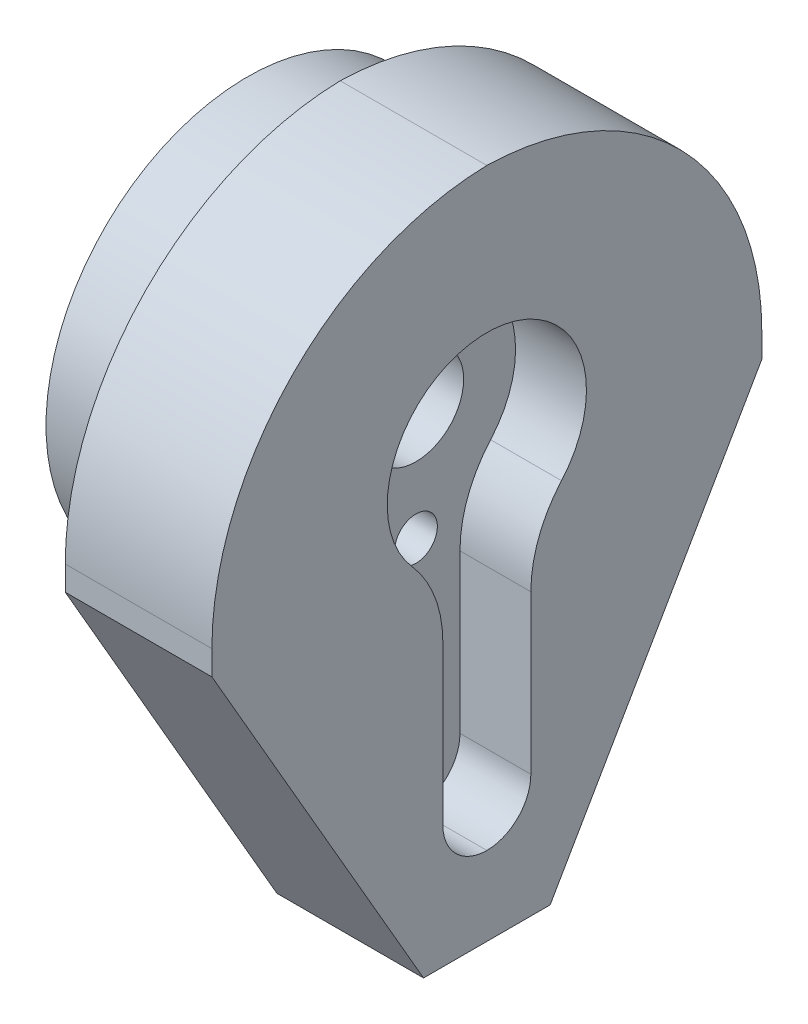
ISO-10303-21;
HEADER;
FILE_DESCRIPTION(('STEP AP214'),'2;1');
FILE_NAME('part.step','',(''),(''),'','','');
FILE_SCHEMA(('AUTOMOTIVE_DESIGN { 1 0 10303 214 1 1 1 1 }'));
ENDSEC;
DATA;
#1=APPLICATION_CONTEXT('core data for automotive mechanical design processes');
#2=APPLICATION_PROTOCOL_DEFINITION('international standard','automotive_design',2000,#1);
#3=PRODUCT_CONTEXT('',#1,'mechanical');
#4=PRODUCT('Part','Part','',(#3));
#5=PRODUCT_RELATED_PRODUCT_CATEGORY('part','',(#4));
#6=PRODUCT_DEFINITION_FORMATION('','',#4);
#7=PRODUCT_DEFINITION_CONTEXT('part definition',#1,'design');
#8=PRODUCT_DEFINITION('design','',#6,#7);
#9=PRODUCT_DEFINITION_SHAPE('','',#8);
#10=(LENGTH_UNIT() NAMED_UNIT(*) SI_UNIT(.MILLI.,.METRE.));
#11=(NAMED_UNIT(*) PLANE_ANGLE_UNIT() SI_UNIT($,.RADIAN.));
#12=(NAMED_UNIT(*) SI_UNIT($,.STERADIAN.) SOLID_ANGLE_UNIT());
#13=UNCERTAINTY_MEASURE_WITH_UNIT(LENGTH_MEASURE(1.E-05),#10,'distance_accuracy_value','');
#14=(GEOMETRIC_REPRESENTATION_CONTEXT(3) GLOBAL_UNCERTAINTY_ASSIGNED_CONTEXT((#13)) GLOBAL_UNIT_ASSIGNED_CONTEXT((#10,
#11,#12)) REPRESENTATION_CONTEXT('',''));
#15=CARTESIAN_POINT('',(0.,0.,0.));
#16=DIRECTION('',(0.,0.,1.));
#17=DIRECTION('',(1.,0.,0.));
#18=AXIS2_PLACEMENT_3D('',#15,#16,#17);
#19=CARTESIAN_POINT('',(20.,0.,0.));
#20=DIRECTION('',(1.,0.,0.));
#21=DIRECTION('',(0.,0.,-1.));
#22=AXIS2_PLACEMENT_3D('',#19,#20,#21);
#23=PLANE('',#22);
#24=CARTESIAN_POINT('',(20.,0.,0.));
#25=DIRECTION('',(1.,0.,0.));
#26=DIRECTION('',(0.,0.,-1.));
#27=AXIS2_PLACEMENT_3D('',#24,#25,#26);
#28=CIRCLE('',#27,17.475);
#29=CARTESIAN_POINT('',(20.,0.,-17.475));
#30=VERTEX_POINT('',#29);
#31=EDGE_CURVE('E11',#30,#30,#28,.T.);
#32=ORIENTED_EDGE('',*,*,#31,.T.);
#33=EDGE_LOOP('',(#32));
#34=FACE_BOUND('',#33,.T.);
#35=CARTESIAN_POINT('',(20.,-20.6,0.));
#36=DIRECTION('',(1.,0.,0.));
#37=DIRECTION('',(0.,0.,-1.));
#38=AXIS2_PLACEMENT_3D('',#35,#36,#37);
#39=CIRCLE('',#38,1.75);
#40=CARTESIAN_POINT('',(20.,-20.6,-1.75));
#41=VERTEX_POINT('',#40);
#42=EDGE_CURVE('E231',#41,#41,#39,.F.);
#43=ORIENTED_EDGE('',*,*,#42,.F.);
#44=EDGE_LOOP('',(#43));
#45=FACE_BOUND('',#44,.T.);
#46=DIRECTION('',(0.,1.,0.));
#47=VECTOR('',#46,1.);
#48=CARTESIAN_POINT('',(20.,35.,-22.5));
#49=LINE('',#48,#47);
#50=CARTESIAN_POINT('',(20.,-4.99999999999982,-22.5));
#51=VERTEX_POINT('',#50);
#52=CARTESIAN_POINT('',(20.,-3.,-22.5));
#53=VERTEX_POINT('',#52);
#54=EDGE_CURVE('E387',#51,#53,#49,.T.);
#55=ORIENTED_EDGE('',*,*,#54,.F.);
#56=DIRECTION('',(0.,0.86602540378444,-0.499999999999998));
#57=VECTOR('',#56,1.);
#58=CARTESIAN_POINT('',(20.,-4.99999999999982,-22.5));
#59=LINE('',#58,#57);
#60=CARTESIAN_POINT('',(20.,-35.,-5.17949192431122));
#61=VERTEX_POINT('',#60);
#62=EDGE_CURVE('E71',#51,#61,#59,.F.);
#63=ORIENTED_EDGE('',*,*,#62,.T.);
#64=DIRECTION('',(0.,0.,-1.));
#65=VECTOR('',#64,1.);
#66=CARTESIAN_POINT('',(20.,-35.,22.5));
#67=LINE('',#66,#65);
#68=CARTESIAN_POINT('',(20.,-35.,5.17949192431121));
#69=VERTEX_POINT('',#68);
#70=EDGE_CURVE('E191',#69,#61,#67,.T.);
#71=ORIENTED_EDGE('',*,*,#70,.F.);
#72=DIRECTION('',(0.,-0.86602540378444,-0.499999999999998));
#73=VECTOR('',#72,1.);
#74=CARTESIAN_POINT('',(20.,-35.,5.1794919243112));
#75=LINE('',#74,#73);
#76=CARTESIAN_POINT('',(20.,-4.99999999999984,22.5));
#77=VERTEX_POINT('',#76);
#78=EDGE_CURVE('E261',#69,#77,#75,.F.);
#79=ORIENTED_EDGE('',*,*,#78,.T.);
#80=DIRECTION('',(0.,-1.,0.));
#81=VECTOR('',#80,1.);
#82=CARTESIAN_POINT('',(20.,35.,22.5));
#83=LINE('',#82,#81);
#84=CARTESIAN_POINT('',(20.,-3.,22.5));
#85=VERTEX_POINT('',#84);
#86=EDGE_CURVE('E382',#85,#77,#83,.T.);
#87=ORIENTED_EDGE('',*,*,#86,.F.);
#88=CARTESIAN_POINT('',(20.,-3.,-0.500000000000004));
#89=DIRECTION('',(1.,0.,0.));
#90=DIRECTION('',(0.,0.,-1.));
#91=AXIS2_PLACEMENT_3D('',#88,#89,#90);
#92=CIRCLE('',#91,23.);
#93=CARTESIAN_POINT('',(20.,19.9945645751338,0.));
#94=VERTEX_POINT('',#93);
#95=EDGE_CURVE('E227',#85,#94,#92,.F.);
#96=ORIENTED_EDGE('',*,*,#95,.T.);
#97=CARTESIAN_POINT('',(20.,-3.,0.499999999999997));
#98=DIRECTION('',(1.,0.,0.));
#99=DIRECTION('',(0.,0.,-1.));
#100=AXIS2_PLACEMENT_3D('',#97,#98,#99);
#101=CIRCLE('',#100,23.);
#102=EDGE_CURVE('E234',#94,#53,#101,.F.);
#103=ORIENTED_EDGE('',*,*,#102,.T.);
#104=EDGE_LOOP('',(#55,#63,#71,#79,#87,#96,#103));
#105=FACE_BOUND('',#104,.T.);
#106=ADVANCED_FACE('F47',(#34,#45,#105),#23,.F.);
#107=CARTESIAN_POINT('',(32.,35.,-22.5));
#108=DIRECTION('',(0.,0.,1.));
#109=DIRECTION('',(0.,-1.,0.));
#110=AXIS2_PLACEMENT_3D('',#107,#108,#109);
#111=PLANE('',#110);
#112=DIRECTION('',(0.,1.,0.));
#113=VECTOR('',#112,1.);
#114=CARTESIAN_POINT('',(32.,35.,-22.5));
#115=LINE('',#114,#113);
#116=CARTESIAN_POINT('',(32.,-4.99999999999982,-22.5));
#117=VERTEX_POINT('',#116);
#118=CARTESIAN_POINT('',(32.,-3.,-22.5));
#119=VERTEX_POINT('',#118);
#120=EDGE_CURVE('E373',#117,#119,#115,.T.);
#121=ORIENTED_EDGE('',*,*,#120,.F.);
#122=DIRECTION('',(-1.,0.,0.));
#123=VECTOR('',#122,1.);
#124=CARTESIAN_POINT('',(32.,-4.99999999999982,-22.5));
#125=LINE('',#124,#123);
#126=EDGE_CURVE('E270',#117,#51,#125,.T.);
#127=ORIENTED_EDGE('',*,*,#126,.T.);
#128=ORIENTED_EDGE('',*,*,#54,.T.);
#129=DIRECTION('',(-1.,0.,0.));
#130=VECTOR('',#129,1.);
#131=CARTESIAN_POINT('',(32.,-3.,-22.5));
#132=LINE('',#131,#130);
#133=EDGE_CURVE('E238',#53,#119,#132,.F.);
#134=ORIENTED_EDGE('',*,*,#133,.T.);
#135=EDGE_LOOP('',(#121,#127,#128,#134));
#136=FACE_BOUND('',#135,.T.);
#137=ADVANCED_FACE('F305',(#136),#111,.F.);
#138=CARTESIAN_POINT('',(32.,35.,22.5));
#139=DIRECTION('',(0.,0.,-1.));
#140=DIRECTION('',(0.,1.,0.));
#141=AXIS2_PLACEMENT_3D('',#138,#139,#140);
#142=PLANE('',#141);
#143=ORIENTED_EDGE('',*,*,#86,.T.);
#144=DIRECTION('',(1.,0.,0.));
#145=VECTOR('',#144,1.);
#146=CARTESIAN_POINT('',(32.,-4.99999999999984,22.5));
#147=LINE('',#146,#145);
#148=CARTESIAN_POINT('',(32.,-4.99999999999984,22.5));
#149=VERTEX_POINT('',#148);
#150=EDGE_CURVE('E264',#77,#149,#147,.T.);
#151=ORIENTED_EDGE('',*,*,#150,.T.);
#152=DIRECTION('',(0.,-1.,0.));
#153=VECTOR('',#152,1.);
#154=CARTESIAN_POINT('',(32.,35.,22.5));
#155=LINE('',#154,#153);
#156=CARTESIAN_POINT('',(32.,-3.,22.5));
#157=VERTEX_POINT('',#156);
#158=EDGE_CURVE('E188',#157,#149,#155,.T.);
#159=ORIENTED_EDGE('',*,*,#158,.F.);
#160=DIRECTION('',(1.,0.,0.));
#161=VECTOR('',#160,1.);
#162=CARTESIAN_POINT('',(20.,-3.,22.5));
#163=LINE('',#162,#161);
#164=EDGE_CURVE('E248',#157,#85,#163,.F.);
#165=ORIENTED_EDGE('',*,*,#164,.T.);
#166=EDGE_LOOP('',(#143,#151,#159,#165));
#167=FACE_BOUND('',#166,.T.);
#168=ADVANCED_FACE('F313',(#167),#142,.F.);
#169=CARTESIAN_POINT('',(32.,0.,0.));
#170=DIRECTION('',(1.,0.,0.));
#171=DIRECTION('',(0.,0.,-1.));
#172=AXIS2_PLACEMENT_3D('',#169,#170,#171);
#173=PLANE('',#172);
#174=DIRECTION('',(0.,-1.,0.));
#175=VECTOR('',#174,1.);
#176=CARTESIAN_POINT('',(32.,-28.55,3.60000000000001));
#177=LINE('',#176,#175);
#178=CARTESIAN_POINT('',(32.,-12.0192553845902,3.6));
#179=VERTEX_POINT('',#178);
#180=CARTESIAN_POINT('',(32.,-24.95,3.60000000000001));
#181=VERTEX_POINT('',#180);
#182=EDGE_CURVE('E152',#179,#181,#177,.T.);
#183=ORIENTED_EDGE('',*,*,#182,.F.);
#184=CARTESIAN_POINT('',(32.,-12.0192553845902,13.6));
#185=DIRECTION('',(1.,0.,0.));
#186=DIRECTION('',(0.,0.,-1.));
#187=AXIS2_PLACEMENT_3D('',#184,#185,#186);
#188=CIRCLE('',#187,10.);
#189=CARTESIAN_POINT('',(32.,-5.39707610933388,6.1068870523416));
#190=VERTEX_POINT('',#189);
#191=EDGE_CURVE('E208',#179,#190,#188,.T.);
#192=ORIENTED_EDGE('',*,*,#191,.T.);
#193=CARTESIAN_POINT('',(32.,0.,0.));
#194=DIRECTION('',(1.,0.,0.));
#195=DIRECTION('',(0.,0.,-1.));
#196=AXIS2_PLACEMENT_3D('',#193,#194,#195);
#197=CIRCLE('',#196,8.15);
#198=CARTESIAN_POINT('',(32.,-5.39707610933388,-6.1068870523416));
#199=VERTEX_POINT('',#198);
#200=EDGE_CURVE('E384',#199,#190,#197,.T.);
#201=ORIENTED_EDGE('',*,*,#200,.F.);
#202=CARTESIAN_POINT('',(32.,-12.0192553845902,-13.6));
#203=DIRECTION('',(1.,0.,0.));
#204=DIRECTION('',(0.,0.,-1.));
#205=AXIS2_PLACEMENT_3D('',#202,#203,#204);
#206=CIRCLE('',#205,10.);
#207=CARTESIAN_POINT('',(32.,-12.0192553845902,-3.6));
#208=VERTEX_POINT('',#207);
#209=EDGE_CURVE('E205',#199,#208,#206,.T.);
#210=ORIENTED_EDGE('',*,*,#209,.T.);
#211=DIRECTION('',(0.,1.,0.));
#212=VECTOR('',#211,1.);
#213=CARTESIAN_POINT('',(32.,-28.55,-3.59999999999999));
#214=LINE('',#213,#212);
#215=CARTESIAN_POINT('',(32.,-24.95,-3.59999999999999));
#216=VERTEX_POINT('',#215);
#217=EDGE_CURVE('E162',#216,#208,#214,.T.);
#218=ORIENTED_EDGE('',*,*,#217,.F.);
#219=CARTESIAN_POINT('',(32.,-24.95,0.));
#220=DIRECTION('',(1.,0.,0.));
#221=DIRECTION('',(0.,0.,-1.));
#222=AXIS2_PLACEMENT_3D('',#219,#220,#221);
#223=CIRCLE('',#222,3.6);
#224=CARTESIAN_POINT('',(32.,-28.55,0.));
#225=VERTEX_POINT('',#224);
#226=EDGE_CURVE('E171',#216,#225,#223,.F.);
#227=ORIENTED_EDGE('',*,*,#226,.T.);
#228=CARTESIAN_POINT('',(32.,-24.95,0.));
#229=DIRECTION('',(1.,0.,0.));
#230=DIRECTION('',(0.,0.,-1.));
#231=AXIS2_PLACEMENT_3D('',#228,#229,#230);
#232=CIRCLE('',#231,3.6);
#233=EDGE_CURVE('E166',#225,#181,#232,.F.);
#234=ORIENTED_EDGE('',*,*,#233,.T.);
#235=EDGE_LOOP('',(#183,#192,#201,#210,#218,#227,#234));
#236=FACE_BOUND('',#235,.T.);
#237=DIRECTION('',(0.,0.,-1.));
#238=VECTOR('',#237,1.);
#239=CARTESIAN_POINT('',(32.,-35.,22.5));
#240=LINE('',#239,#238);
#241=CARTESIAN_POINT('',(32.,-35.,5.17949192431121));
#242=VERTEX_POINT('',#241);
#243=CARTESIAN_POINT('',(32.,-35.,-5.17949192431122));
#244=VERTEX_POINT('',#243);
#245=EDGE_CURVE('E183',#242,#244,#240,.T.);
#246=ORIENTED_EDGE('',*,*,#245,.T.);
#247=DIRECTION('',(0.,-0.86602540378444,0.499999999999998));
#248=VECTOR('',#247,1.);
#249=CARTESIAN_POINT('',(32.,-10.9927857925749,-19.0400635094611));
#250=LINE('',#249,#248);
#251=EDGE_CURVE('E278',#244,#117,#250,.F.);
#252=ORIENTED_EDGE('',*,*,#251,.T.);
#253=ORIENTED_EDGE('',*,*,#120,.T.);
#254=CARTESIAN_POINT('',(32.,-3.,0.499999999999997));
#255=DIRECTION('',(1.,0.,0.));
#256=DIRECTION('',(0.,0.,-1.));
#257=AXIS2_PLACEMENT_3D('',#254,#255,#256);
#258=CIRCLE('',#257,23.);
#259=CARTESIAN_POINT('',(32.,19.9945645751338,0.));
#260=VERTEX_POINT('',#259);
#261=EDGE_CURVE('E245',#119,#260,#258,.T.);
#262=ORIENTED_EDGE('',*,*,#261,.T.);
#263=CARTESIAN_POINT('',(32.,-3.,-0.500000000000004));
#264=DIRECTION('',(1.,0.,0.));
#265=DIRECTION('',(0.,0.,-1.));
#266=AXIS2_PLACEMENT_3D('',#263,#264,#265);
#267=CIRCLE('',#266,23.);
#268=EDGE_CURVE('E242',#260,#157,#267,.T.);
#269=ORIENTED_EDGE('',*,*,#268,.T.);
#270=ORIENTED_EDGE('',*,*,#158,.T.);
#271=DIRECTION('',(0.,0.86602540378444,0.499999999999998));
#272=VECTOR('',#271,1.);
#273=CARTESIAN_POINT('',(32.,-10.9927857925749,19.0400635094611));
#274=LINE('',#273,#272);
#275=EDGE_CURVE('E267',#149,#242,#274,.F.);
#276=ORIENTED_EDGE('',*,*,#275,.T.);
#277=EDGE_LOOP('',(#246,#252,#253,#262,#269,#270,#276));
#278=FACE_BOUND('',#277,.T.);
#279=ADVANCED_FACE('F167',(#236,#278),#173,.T.);
#280=CARTESIAN_POINT('',(32.,-35.,22.5));
#281=DIRECTION('',(0.,1.,0.));
#282=DIRECTION('',(0.,0.,1.));
#283=AXIS2_PLACEMENT_3D('',#280,#281,#282);
#284=PLANE('',#283);
#285=ORIENTED_EDGE('',*,*,#70,.T.);
#286=DIRECTION('',(1.,0.,0.));
#287=VECTOR('',#286,1.);
#288=CARTESIAN_POINT('',(32.,-35.,-5.17949192431122));
#289=LINE('',#288,#287);
#290=EDGE_CURVE('E63',#61,#244,#289,.T.);
#291=ORIENTED_EDGE('',*,*,#290,.T.);
#292=ORIENTED_EDGE('',*,*,#245,.F.);
#293=DIRECTION('',(-1.,0.,0.));
#294=VECTOR('',#293,1.);
#295=CARTESIAN_POINT('',(32.,-35.,5.1794919243112));
#296=LINE('',#295,#294);
#297=EDGE_CURVE('E251',#242,#69,#296,.T.);
#298=ORIENTED_EDGE('',*,*,#297,.T.);
#299=EDGE_LOOP('',(#285,#291,#292,#298));
#300=FACE_BOUND('',#299,.T.);
#301=ADVANCED_FACE('F320',(#300),#284,.F.);
#302=CARTESIAN_POINT('',(26.2,-28.55,3.60000000000001));
#303=DIRECTION('',(0.,0.,1.));
#304=DIRECTION('',(0.,-1.,0.));
#305=AXIS2_PLACEMENT_3D('',#302,#303,#304);
#306=PLANE('',#305);
#307=DIRECTION('',(0.,-1.,0.));
#308=VECTOR('',#307,1.);
#309=CARTESIAN_POINT('',(26.2,-28.55,3.60000000000001));
#310=LINE('',#309,#308);
#311=CARTESIAN_POINT('',(26.2,-12.0192553845902,3.6));
#312=VERTEX_POINT('',#311);
#313=CARTESIAN_POINT('',(26.2,-24.95,3.60000000000001));
#314=VERTEX_POINT('',#313);
#315=EDGE_CURVE('E409',#312,#314,#310,.T.);
#316=ORIENTED_EDGE('',*,*,#315,.F.);
#317=DIRECTION('',(1.,0.,0.));
#318=VECTOR('',#317,1.);
#319=CARTESIAN_POINT('',(26.2,-12.0192553845902,3.6));
#320=LINE('',#319,#318);
#321=EDGE_CURVE('E159',#312,#179,#320,.T.);
#322=ORIENTED_EDGE('',*,*,#321,.T.);
#323=ORIENTED_EDGE('',*,*,#182,.T.);
#324=DIRECTION('',(1.,0.,0.));
#325=VECTOR('',#324,1.);
#326=CARTESIAN_POINT('',(26.2,-24.95,3.60000000000001));
#327=LINE('',#326,#325);
#328=EDGE_CURVE('E157',#181,#314,#327,.F.);
#329=ORIENTED_EDGE('',*,*,#328,.T.);
#330=EDGE_LOOP('',(#316,#322,#323,#329));
#331=FACE_BOUND('',#330,.T.);
#332=ADVANCED_FACE('F155',(#331),#306,.F.);
#333=CARTESIAN_POINT('',(26.2,0.,0.));
#334=DIRECTION('',(1.,0.,0.));
#335=DIRECTION('',(0.,0.,-1.));
#336=AXIS2_PLACEMENT_3D('',#333,#334,#335);
#337=CYLINDRICAL_SURFACE('',#336,8.15);
#338=ORIENTED_EDGE('',*,*,#200,.T.);
#339=DIRECTION('',(1.,0.,0.));
#340=VECTOR('',#339,1.);
#341=CARTESIAN_POINT('',(26.2,-5.39707610933388,6.1068870523416));
#342=LINE('',#341,#340);
#343=CARTESIAN_POINT('',(26.2,-5.39707610933388,6.1068870523416));
#344=VERTEX_POINT('',#343);
#345=EDGE_CURVE('E215',#190,#344,#342,.F.);
#346=ORIENTED_EDGE('',*,*,#345,.T.);
#347=CARTESIAN_POINT('',(26.2,0.,0.));
#348=DIRECTION('',(1.,0.,0.));
#349=DIRECTION('',(0.,0.,-1.));
#350=AXIS2_PLACEMENT_3D('',#347,#348,#349);
#351=CIRCLE('',#350,8.15);
#352=CARTESIAN_POINT('',(26.2,-5.39707610933388,-6.1068870523416));
#353=VERTEX_POINT('',#352);
#354=EDGE_CURVE('E389',#353,#344,#351,.T.);
#355=ORIENTED_EDGE('',*,*,#354,.F.);
#356=DIRECTION('',(1.,0.,0.));
#357=VECTOR('',#356,1.);
#358=CARTESIAN_POINT('',(26.2,-5.39707610933388,-6.1068870523416));
#359=LINE('',#358,#357);
#360=EDGE_CURVE('E211',#353,#199,#359,.T.);
#361=ORIENTED_EDGE('',*,*,#360,.T.);
#362=EDGE_LOOP('',(#338,#346,#355,#361));
#363=FACE_BOUND('',#362,.T.);
#364=ADVANCED_FACE('F467',(#363),#337,.F.);
#365=CARTESIAN_POINT('',(26.2,-28.55,-3.59999999999999));
#366=DIRECTION('',(0.,0.,-1.));
#367=DIRECTION('',(0.,1.,0.));
#368=AXIS2_PLACEMENT_3D('',#365,#366,#367);
#369=PLANE('',#368);
#370=ORIENTED_EDGE('',*,*,#217,.T.);
#371=DIRECTION('',(1.,0.,0.));
#372=VECTOR('',#371,1.);
#373=CARTESIAN_POINT('',(26.2,-12.0192553845902,-3.6));
#374=LINE('',#373,#372);
#375=CARTESIAN_POINT('',(26.2,-12.0192553845902,-3.6));
#376=VERTEX_POINT('',#375);
#377=EDGE_CURVE('E218',#208,#376,#374,.F.);
#378=ORIENTED_EDGE('',*,*,#377,.T.);
#379=DIRECTION('',(0.,1.,0.));
#380=VECTOR('',#379,1.);
#381=CARTESIAN_POINT('',(26.2,-28.55,-3.59999999999999));
#382=LINE('',#381,#380);
#383=CARTESIAN_POINT('',(26.2,-24.95,-3.59999999999999));
#384=VERTEX_POINT('',#383);
#385=EDGE_CURVE('E405',#384,#376,#382,.T.);
#386=ORIENTED_EDGE('',*,*,#385,.F.);
#387=DIRECTION('',(1.,0.,0.));
#388=VECTOR('',#387,1.);
#389=CARTESIAN_POINT('',(32.,-24.95,-3.59999999999999));
#390=LINE('',#389,#388);
#391=EDGE_CURVE('E176',#384,#216,#390,.T.);
#392=ORIENTED_EDGE('',*,*,#391,.T.);
#393=EDGE_LOOP('',(#370,#378,#386,#392));
#394=FACE_BOUND('',#393,.T.);
#395=ADVANCED_FACE('F465',(#394),#369,.F.);
#396=CARTESIAN_POINT('',(26.2,0.,0.));
#397=DIRECTION('',(1.,0.,0.));
#398=DIRECTION('',(0.,0.,-1.));
#399=AXIS2_PLACEMENT_3D('',#396,#397,#398);
#400=PLANE('',#399);
#401=CARTESIAN_POINT('',(26.2,-20.6,0.));
#402=DIRECTION('',(1.,0.,0.));
#403=DIRECTION('',(0.,0.,-1.));
#404=AXIS2_PLACEMENT_3D('',#401,#402,#403);
#405=CIRCLE('',#404,1.75);
#406=CARTESIAN_POINT('',(26.2,-20.6,-1.75));
#407=VERTEX_POINT('',#406);
#408=EDGE_CURVE('E419',#407,#407,#405,.T.);
#409=ORIENTED_EDGE('',*,*,#408,.F.);
#410=EDGE_LOOP('',(#409));
#411=FACE_BOUND('',#410,.T.);
#412=CARTESIAN_POINT('',(26.2,-9.35,0.));
#413=DIRECTION('',(1.,0.,0.));
#414=DIRECTION('',(0.,0.,-1.));
#415=AXIS2_PLACEMENT_3D('',#412,#413,#414);
#416=CIRCLE('',#415,1.75);
#417=CARTESIAN_POINT('',(26.2,-9.35,-1.75));
#418=VERTEX_POINT('',#417);
#419=EDGE_CURVE('E423',#418,#418,#416,.T.);
#420=ORIENTED_EDGE('',*,*,#419,.F.);
#421=EDGE_LOOP('',(#420));
#422=FACE_BOUND('',#421,.T.);
#423=CARTESIAN_POINT('',(26.2,0.,0.));
#424=DIRECTION('',(1.,0.,0.));
#425=DIRECTION('',(0.,0.,-1.));
#426=AXIS2_PLACEMENT_3D('',#423,#424,#425);
#427=CIRCLE('',#426,3.9);
#428=CARTESIAN_POINT('',(26.2,0.,-3.9));
#429=VERTEX_POINT('',#428);
#430=EDGE_CURVE('E202',#429,#429,#427,.T.);
#431=ORIENTED_EDGE('',*,*,#430,.F.);
#432=EDGE_LOOP('',(#431));
#433=FACE_BOUND('',#432,.T.);
#434=ORIENTED_EDGE('',*,*,#354,.T.);
#435=CARTESIAN_POINT('',(26.2,-12.0192553845902,13.6));
#436=DIRECTION('',(1.,0.,0.));
#437=DIRECTION('',(0.,0.,-1.));
#438=AXIS2_PLACEMENT_3D('',#435,#436,#437);
#439=CIRCLE('',#438,10.);
#440=EDGE_CURVE('E221',#344,#312,#439,.F.);
#441=ORIENTED_EDGE('',*,*,#440,.T.);
#442=ORIENTED_EDGE('',*,*,#315,.T.);
#443=CARTESIAN_POINT('',(26.2,-24.95,0.));
#444=DIRECTION('',(1.,0.,0.));
#445=DIRECTION('',(0.,0.,-1.));
#446=AXIS2_PLACEMENT_3D('',#443,#444,#445);
#447=CIRCLE('',#446,3.6);
#448=CARTESIAN_POINT('',(26.2,-28.55,0.));
#449=VERTEX_POINT('',#448);
#450=EDGE_CURVE('E180',#314,#449,#447,.T.);
#451=ORIENTED_EDGE('',*,*,#450,.T.);
#452=CARTESIAN_POINT('',(26.2,-24.95,0.));
#453=DIRECTION('',(1.,0.,0.));
#454=DIRECTION('',(0.,0.,-1.));
#455=AXIS2_PLACEMENT_3D('',#452,#453,#454);
#456=CIRCLE('',#455,3.6);
#457=EDGE_CURVE('E182',#449,#384,#456,.T.);
#458=ORIENTED_EDGE('',*,*,#457,.T.);
#459=ORIENTED_EDGE('',*,*,#385,.T.);
#460=CARTESIAN_POINT('',(26.2,-12.0192553845902,-13.6));
#461=DIRECTION('',(1.,0.,0.));
#462=DIRECTION('',(0.,0.,-1.));
#463=AXIS2_PLACEMENT_3D('',#460,#461,#462);
#464=CIRCLE('',#463,10.);
#465=EDGE_CURVE('E224',#376,#353,#464,.F.);
#466=ORIENTED_EDGE('',*,*,#465,.T.);
#467=EDGE_LOOP('',(#434,#441,#442,#451,#458,#459,#466));
#468=FACE_BOUND('',#467,.T.);
#469=ADVANCED_FACE('F332',(#411,#422,#433,#468),#400,.T.);
#470=CARTESIAN_POINT('',(26.2,-24.95,0.));
#471=DIRECTION('',(-1.,0.,0.));
#472=DIRECTION('',(0.,0.,1.));
#473=AXIS2_PLACEMENT_3D('',#470,#471,#472);
#474=CYLINDRICAL_SURFACE('',#473,3.6);
#475=ORIENTED_EDGE('',*,*,#391,.F.);
#476=ORIENTED_EDGE('',*,*,#457,.F.);
#477=DIRECTION('',(1.,0.,0.));
#478=VECTOR('',#477,1.);
#479=CARTESIAN_POINT('',(26.2,-28.55,0.));
#480=LINE('',#479,#478);
#481=EDGE_CURVE('E163',#225,#449,#480,.F.);
#482=ORIENTED_EDGE('',*,*,#481,.F.);
#483=ORIENTED_EDGE('',*,*,#226,.F.);
#484=EDGE_LOOP('',(#475,#476,#482,#483));
#485=FACE_BOUND('',#484,.T.);
#486=ADVANCED_FACE('F329',(#485),#474,.F.);
#487=CARTESIAN_POINT('',(26.2,-24.95,0.));
#488=DIRECTION('',(-1.,0.,0.));
#489=DIRECTION('',(0.,0.,1.));
#490=AXIS2_PLACEMENT_3D('',#487,#488,#489);
#491=CYLINDRICAL_SURFACE('',#490,3.6);
#492=ORIENTED_EDGE('',*,*,#450,.F.);
#493=ORIENTED_EDGE('',*,*,#328,.F.);
#494=ORIENTED_EDGE('',*,*,#233,.F.);
#495=ORIENTED_EDGE('',*,*,#481,.T.);
#496=EDGE_LOOP('',(#492,#493,#494,#495));
#497=FACE_BOUND('',#496,.T.);
#498=ADVANCED_FACE('F179',(#497),#491,.F.);
#499=CARTESIAN_POINT('',(26.2,-12.0192553845902,13.6));
#500=DIRECTION('',(1.,0.,0.));
#501=DIRECTION('',(0.,0.,-1.));
#502=AXIS2_PLACEMENT_3D('',#499,#500,#501);
#503=CYLINDRICAL_SURFACE('',#502,10.);
#504=ORIENTED_EDGE('',*,*,#440,.F.);
#505=ORIENTED_EDGE('',*,*,#345,.F.);
#506=ORIENTED_EDGE('',*,*,#191,.F.);
#507=ORIENTED_EDGE('',*,*,#321,.F.);
#508=EDGE_LOOP('',(#504,#505,#506,#507));
#509=FACE_BOUND('',#508,.T.);
#510=ADVANCED_FACE('F328',(#509),#503,.T.);
#511=CARTESIAN_POINT('',(26.2,-12.0192553845902,-13.6));
#512=DIRECTION('',(1.,0.,0.));
#513=DIRECTION('',(0.,0.,-1.));
#514=AXIS2_PLACEMENT_3D('',#511,#512,#513);
#515=CYLINDRICAL_SURFACE('',#514,10.);
#516=ORIENTED_EDGE('',*,*,#465,.F.);
#517=ORIENTED_EDGE('',*,*,#377,.F.);
#518=ORIENTED_EDGE('',*,*,#209,.F.);
#519=ORIENTED_EDGE('',*,*,#360,.F.);
#520=EDGE_LOOP('',(#516,#517,#518,#519));
#521=FACE_BOUND('',#520,.T.);
#522=ADVANCED_FACE('F336',(#521),#515,.T.);
#523=CARTESIAN_POINT('',(32.,0.,0.));
#524=DIRECTION('',(-1.,0.,0.));
#525=DIRECTION('',(0.,0.,1.));
#526=AXIS2_PLACEMENT_3D('',#523,#524,#525);
#527=CYLINDRICAL_SURFACE('',#526,3.9);
#528=CARTESIAN_POINT('',(20.,0.,0.));
#529=DIRECTION('',(-1.,0.,0.));
#530=DIRECTION('',(0.,0.,1.));
#531=AXIS2_PLACEMENT_3D('',#528,#529,#530);
#532=CIRCLE('',#531,3.9);
#533=CARTESIAN_POINT('',(20.,0.,3.9));
#534=VERTEX_POINT('',#533);
#535=EDGE_CURVE('E433',#534,#534,#532,.F.);
#536=ORIENTED_EDGE('',*,*,#535,.F.);
#537=EDGE_LOOP('',(#536));
#538=FACE_BOUND('',#537,.T.);
#539=ORIENTED_EDGE('',*,*,#430,.T.);
#540=EDGE_LOOP('',(#539));
#541=FACE_BOUND('',#540,.T.);
#542=ADVANCED_FACE('F340',(#538,#541),#527,.F.);
#543=CARTESIAN_POINT('',(-0.001000000000001,-9.35,0.));
#544=DIRECTION('',(1.,0.,0.));
#545=DIRECTION('',(0.,0.,-1.));
#546=AXIS2_PLACEMENT_3D('',#543,#544,#545);
#547=CYLINDRICAL_SURFACE('',#546,1.75);
#548=ORIENTED_EDGE('',*,*,#419,.T.);
#549=EDGE_LOOP('',(#548));
#550=FACE_BOUND('',#549,.T.);
#551=CARTESIAN_POINT('',(20.,-9.35,0.));
#552=DIRECTION('',(-1.,0.,0.));
#553=DIRECTION('',(0.,0.,1.));
#554=AXIS2_PLACEMENT_3D('',#551,#552,#553);
#555=CIRCLE('',#554,1.75);
#556=CARTESIAN_POINT('',(20.,-9.35,1.75));
#557=VERTEX_POINT('',#556);
#558=EDGE_CURVE('E257',#557,#557,#555,.F.);
#559=ORIENTED_EDGE('',*,*,#558,.F.);
#560=EDGE_LOOP('',(#559));
#561=FACE_BOUND('',#560,.T.);
#562=ADVANCED_FACE('F452',(#550,#561),#547,.F.);
#563=CARTESIAN_POINT('',(-0.001000000000001,-20.6,0.));
#564=DIRECTION('',(1.,0.,0.));
#565=DIRECTION('',(0.,0.,-1.));
#566=AXIS2_PLACEMENT_3D('',#563,#564,#565);
#567=CYLINDRICAL_SURFACE('',#566,1.75);
#568=ORIENTED_EDGE('',*,*,#408,.T.);
#569=EDGE_LOOP('',(#568));
#570=FACE_BOUND('',#569,.T.);
#571=ORIENTED_EDGE('',*,*,#42,.T.);
#572=EDGE_LOOP('',(#571));
#573=FACE_BOUND('',#572,.T.);
#574=ADVANCED_FACE('F447',(#570,#573),#567,.F.);
#575=CARTESIAN_POINT('',(12.4,0.,0.));
#576=DIRECTION('',(1.,0.,0.));
#577=DIRECTION('',(0.,0.,-1.));
#578=AXIS2_PLACEMENT_3D('',#575,#576,#577);
#579=CYLINDRICAL_SURFACE('',#578,16.475);
#580=CARTESIAN_POINT('',(19.,0.,0.));
#581=DIRECTION('',(1.,0.,0.));
#582=DIRECTION('',(0.,0.,-1.));
#583=AXIS2_PLACEMENT_3D('',#580,#581,#582);
#584=CIRCLE('',#583,16.475);
#585=CARTESIAN_POINT('',(19.,0.,-16.475));
#586=VERTEX_POINT('',#585);
#587=EDGE_CURVE('E56',#586,#586,#584,.F.);
#588=CARTESIAN_POINT('',(12.4,0.,0.));
#589=DIRECTION('',(-1.,0.,0.));
#590=DIRECTION('',(0.,0.,1.));
#591=AXIS2_PLACEMENT_3D('',#588,#589,#590);
#592=CIRCLE('',#591,16.475);
#593=CARTESIAN_POINT('',(12.4,0.,-16.475));
#594=VERTEX_POINT('',#593);
#595=EDGE_CURVE('E256',#594,#594,#592,.T.);
#596=CARTESIAN_POINT('',(19.,0.,-16.475));
#597=CARTESIAN_POINT('',(18.93125,0.,-16.475));
#598=CARTESIAN_POINT('',(18.8625,0.,-16.475));
#599=CARTESIAN_POINT('',(18.725,0.,-16.475));
#600=CARTESIAN_POINT('',(18.65625,0.,-16.475));
#601=CARTESIAN_POINT('',(18.51875,0.,-16.475));
#602=CARTESIAN_POINT('',(18.45,0.,-16.475));
#603=CARTESIAN_POINT('',(18.3125,0.,-16.475));
#604=CARTESIAN_POINT('',(18.24375,0.,-16.475));
#605=CARTESIAN_POINT('',(18.10625,0.,-16.475));
#606=CARTESIAN_POINT('',(18.0375,0.,-16.475));
#607=CARTESIAN_POINT('',(17.9,0.,-16.475));
#608=CARTESIAN_POINT('',(17.83125,0.,-16.475));
#609=CARTESIAN_POINT('',(17.69375,0.,-16.475));
#610=CARTESIAN_POINT('',(17.625,0.,-16.475));
#611=CARTESIAN_POINT('',(17.4875,0.,-16.475));
#612=CARTESIAN_POINT('',(17.41875,0.,-16.475));
#613=CARTESIAN_POINT('',(17.28125,0.,-16.475));
#614=CARTESIAN_POINT('',(17.2125,0.,-16.475));
#615=CARTESIAN_POINT('',(17.075,0.,-16.475));
#616=CARTESIAN_POINT('',(17.00625,0.,-16.475));
#617=CARTESIAN_POINT('',(16.86875,0.,-16.475));
#618=CARTESIAN_POINT('',(16.8,0.,-16.475));
#619=CARTESIAN_POINT('',(16.6625,0.,-16.475));
#620=CARTESIAN_POINT('',(16.59375,0.,-16.475));
#621=CARTESIAN_POINT('',(16.45625,0.,-16.475));
#622=CARTESIAN_POINT('',(16.3875,0.,-16.475));
#623=CARTESIAN_POINT('',(16.25,0.,-16.475));
#624=CARTESIAN_POINT('',(16.18125,0.,-16.475));
#625=CARTESIAN_POINT('',(16.04375,0.,-16.475));
#626=CARTESIAN_POINT('',(15.975,0.,-16.475));
#627=CARTESIAN_POINT('',(15.8375,0.,-16.475));
#628=CARTESIAN_POINT('',(15.76875,0.,-16.475));
#629=CARTESIAN_POINT('',(15.63125,0.,-16.475));
#630=CARTESIAN_POINT('',(15.5625,0.,-16.475));
#631=CARTESIAN_POINT('',(15.425,0.,-16.475));
#632=CARTESIAN_POINT('',(15.35625,0.,-16.475));
#633=CARTESIAN_POINT('',(15.21875,0.,-16.475));
#634=CARTESIAN_POINT('',(15.15,0.,-16.475));
#635=CARTESIAN_POINT('',(15.0125,0.,-16.475));
#636=CARTESIAN_POINT('',(14.94375,0.,-16.475));
#637=CARTESIAN_POINT('',(14.80625,0.,-16.475));
#638=CARTESIAN_POINT('',(14.7375,0.,-16.475));
#639=CARTESIAN_POINT('',(14.6,0.,-16.475));
#640=CARTESIAN_POINT('',(14.53125,0.,-16.475));
#641=CARTESIAN_POINT('',(14.39375,0.,-16.475));
#642=CARTESIAN_POINT('',(14.325,0.,-16.475));
#643=CARTESIAN_POINT('',(14.1875,0.,-16.475));
#644=CARTESIAN_POINT('',(14.11875,0.,-16.475));
#645=CARTESIAN_POINT('',(13.98125,0.,-16.475));
#646=CARTESIAN_POINT('',(13.9125,0.,-16.475));
#647=CARTESIAN_POINT('',(13.775,0.,-16.475));
#648=CARTESIAN_POINT('',(13.70625,0.,-16.475));
#649=CARTESIAN_POINT('',(13.56875,0.,-16.475));
#650=CARTESIAN_POINT('',(13.5,0.,-16.475));
#651=CARTESIAN_POINT('',(13.3625,0.,-16.475));
#652=CARTESIAN_POINT('',(13.29375,0.,-16.475));
#653=CARTESIAN_POINT('',(13.15625,0.,-16.475));
#654=CARTESIAN_POINT('',(13.0875,0.,-16.475));
#655=CARTESIAN_POINT('',(12.95,0.,-16.475));
#656=CARTESIAN_POINT('',(12.88125,0.,-16.475));
#657=CARTESIAN_POINT('',(12.74375,0.,-16.475));
#658=CARTESIAN_POINT('',(12.675,0.,-16.475));
#659=CARTESIAN_POINT('',(12.5375,0.,-16.475));
#660=CARTESIAN_POINT('',(12.46875,0.,-16.475));
#661=CARTESIAN_POINT('',(12.4,0.,-16.475));
#662=B_SPLINE_CURVE_WITH_KNOTS('',3,(#596,#597,#598,#599,#600,#601,#602,#603,#604,#605,#606,
#607,#608,#609,#610,#611,#612,#613,#614,#615,#616,#617,#618,#619,#620,#621,#622,#623,#624,#625,
#626,#627,#628,#629,#630,#631,#632,#633,#634,#635,#636,#637,#638,#639,#640,#641,#642,#643,#644,
#645,#646,#647,#648,#649,#650,#651,#652,#653,#654,#655,#656,#657,#658,#659,#660,#661),
.UNSPECIFIED.,.F.,.F.,(4,2,2,2,2,2,2,2,2,2,2,2,2,2,2,2,2,2,2,2,2,2,2,2,2,2,2,2,2,2,2,2,4),(0.,
0.206250000000002,0.4125,0.618750000000001,0.824999999999999,1.03125,1.2375,1.44375,1.65,
1.85625,2.0625,2.26875,2.475,2.68125,2.8875,3.09375,3.3,3.50625,3.7125,3.91875,4.125,4.33125,
4.5375,4.74375,4.95,5.15625,5.3625,5.56875,5.775,5.98125,6.1875,6.39375,6.6),.UNSPECIFIED.);
#663=EDGE_CURVE('BSEAM292',#586,#594,#662,.T.);
#664=ORIENTED_EDGE('',*,*,#587,.T.);
#665=ORIENTED_EDGE('',*,*,#595,.F.);
#666=ORIENTED_EDGE('',*,*,#663,.T.);
#667=ORIENTED_EDGE('',*,*,#663,.F.);
#668=EDGE_LOOP('',(#664,#666,#665,#667));
#669=FACE_BOUND('',#668,.T.);
#670=ADVANCED_FACE('F292',(#669),#579,.T.);
#671=CARTESIAN_POINT('',(12.4,0.,0.));
#672=DIRECTION('',(-1.,0.,0.));
#673=DIRECTION('',(0.,0.,1.));
#674=AXIS2_PLACEMENT_3D('',#671,#672,#673);
#675=PLANE('',#674);
#676=CARTESIAN_POINT('',(12.4,0.,0.));
#677=DIRECTION('',(-1.,0.,0.));
#678=DIRECTION('',(0.,0.,1.));
#679=AXIS2_PLACEMENT_3D('',#676,#677,#678);
#680=CIRCLE('',#679,13.475);
#681=CARTESIAN_POINT('',(12.4,0.,13.475));
#682=VERTEX_POINT('',#681);
#683=EDGE_CURVE('E437',#682,#682,#680,.T.);
#684=ORIENTED_EDGE('',*,*,#683,.F.);
#685=EDGE_LOOP('',(#684));
#686=FACE_BOUND('',#685,.T.);
#687=ORIENTED_EDGE('',*,*,#595,.T.);
#688=EDGE_LOOP('',(#687));
#689=FACE_BOUND('',#688,.T.);
#690=ADVANCED_FACE('F350',(#686,#689),#675,.T.);
#691=CARTESIAN_POINT('',(0.,-3.,-0.500000000000004));
#692=DIRECTION('',(-1.,0.,0.));
#693=DIRECTION('',(0.,0.,1.));
#694=AXIS2_PLACEMENT_3D('',#691,#692,#693);
#695=CYLINDRICAL_SURFACE('',#694,23.);
#696=ORIENTED_EDGE('',*,*,#164,.F.);
#697=ORIENTED_EDGE('',*,*,#268,.F.);
#698=DIRECTION('',(-1.,0.,0.));
#699=VECTOR('',#698,1.);
#700=CARTESIAN_POINT('',(26.,19.9945645751338,0.));
#701=LINE('',#700,#699);
#702=EDGE_CURVE('E252',#94,#260,#701,.F.);
#703=ORIENTED_EDGE('',*,*,#702,.F.);
#704=ORIENTED_EDGE('',*,*,#95,.F.);
#705=EDGE_LOOP('',(#696,#697,#703,#704));
#706=FACE_BOUND('',#705,.T.);
#707=ADVANCED_FACE('F346',(#706),#695,.T.);
#708=CARTESIAN_POINT('',(0.,-3.,0.499999999999997));
#709=DIRECTION('',(1.,0.,0.));
#710=DIRECTION('',(0.,0.,-1.));
#711=AXIS2_PLACEMENT_3D('',#708,#709,#710);
#712=CYLINDRICAL_SURFACE('',#711,23.);
#713=ORIENTED_EDGE('',*,*,#261,.F.);
#714=ORIENTED_EDGE('',*,*,#133,.F.);
#715=ORIENTED_EDGE('',*,*,#102,.F.);
#716=ORIENTED_EDGE('',*,*,#702,.T.);
#717=EDGE_LOOP('',(#713,#714,#715,#716));
#718=FACE_BOUND('',#717,.T.);
#719=ADVANCED_FACE('F342',(#718),#712,.T.);
#720=CARTESIAN_POINT('',(32.,-35.,5.1794919243112));
#721=DIRECTION('',(0.,0.499999999999998,-0.86602540378444));
#722=DIRECTION('',(-1.,0.,0.));
#723=AXIS2_PLACEMENT_3D('',#720,#721,#722);
#724=PLANE('',#723);
#725=ORIENTED_EDGE('',*,*,#275,.F.);
#726=ORIENTED_EDGE('',*,*,#150,.F.);
#727=ORIENTED_EDGE('',*,*,#78,.F.);
#728=ORIENTED_EDGE('',*,*,#297,.F.);
#729=EDGE_LOOP('',(#725,#726,#727,#728));
#730=FACE_BOUND('',#729,.T.);
#731=ADVANCED_FACE('F345',(#730),#724,.F.);
#732=CARTESIAN_POINT('',(32.,-4.99999999999982,-22.5));
#733=DIRECTION('',(0.,0.499999999999998,0.86602540378444));
#734=DIRECTION('',(-1.,0.,0.));
#735=AXIS2_PLACEMENT_3D('',#732,#733,#734);
#736=PLANE('',#735);
#737=ORIENTED_EDGE('',*,*,#251,.F.);
#738=ORIENTED_EDGE('',*,*,#290,.F.);
#739=ORIENTED_EDGE('',*,*,#62,.F.);
#740=ORIENTED_EDGE('',*,*,#126,.F.);
#741=EDGE_LOOP('',(#737,#738,#739,#740));
#742=FACE_BOUND('',#741,.T.);
#743=ADVANCED_FACE('F358',(#742),#736,.F.);
#744=CARTESIAN_POINT('',(20.,0.,0.));
#745=DIRECTION('',(-1.,0.,0.));
#746=DIRECTION('',(0.,0.,1.));
#747=AXIS2_PLACEMENT_3D('',#744,#745,#746);
#748=PLANE('',#747);
#749=CARTESIAN_POINT('',(20.,0.,0.));
#750=DIRECTION('',(-1.,0.,0.));
#751=DIRECTION('',(0.,0.,1.));
#752=AXIS2_PLACEMENT_3D('',#749,#750,#751);
#753=CIRCLE('',#752,12.475);
#754=CARTESIAN_POINT('',(20.,0.,12.475));
#755=VERTEX_POINT('',#754);
#756=EDGE_CURVE('E281',#755,#755,#753,.T.);
#757=ORIENTED_EDGE('',*,*,#756,.T.);
#758=EDGE_LOOP('',(#757));
#759=FACE_BOUND('',#758,.T.);
#760=ORIENTED_EDGE('',*,*,#535,.T.);
#761=EDGE_LOOP('',(#760));
#762=FACE_BOUND('',#761,.T.);
#763=ORIENTED_EDGE('',*,*,#558,.T.);
#764=EDGE_LOOP('',(#763));
#765=FACE_BOUND('',#764,.T.);
#766=ADVANCED_FACE('F363',(#759,#762,#765),#748,.T.);
#767=CARTESIAN_POINT('',(20.,0.,0.));
#768=DIRECTION('',(-1.,0.,0.));
#769=DIRECTION('',(0.,0.,1.));
#770=AXIS2_PLACEMENT_3D('',#767,#768,#769);
#771=CYLINDRICAL_SURFACE('',#770,13.475);
#772=CARTESIAN_POINT('',(19.,0.,0.));
#773=DIRECTION('',(-1.,0.,0.));
#774=DIRECTION('',(0.,0.,1.));
#775=AXIS2_PLACEMENT_3D('',#772,#773,#774);
#776=CIRCLE('',#775,13.475);
#777=CARTESIAN_POINT('',(19.,0.,13.475));
#778=VERTEX_POINT('',#777);
#779=EDGE_CURVE('E285',#778,#778,#776,.F.);
#780=CARTESIAN_POINT('',(19.,0.,13.475));
#781=CARTESIAN_POINT('',(18.93125,0.,13.475));
#782=CARTESIAN_POINT('',(18.8625,0.,13.475));
#783=CARTESIAN_POINT('',(18.725,0.,13.475));
#784=CARTESIAN_POINT('',(18.65625,0.,13.475));
#785=CARTESIAN_POINT('',(18.51875,0.,13.475));
#786=CARTESIAN_POINT('',(18.45,0.,13.475));
#787=CARTESIAN_POINT('',(18.3125,0.,13.475));
#788=CARTESIAN_POINT('',(18.24375,0.,13.475));
#789=CARTESIAN_POINT('',(18.10625,0.,13.475));
#790=CARTESIAN_POINT('',(18.0375,0.,13.475));
#791=CARTESIAN_POINT('',(17.9,0.,13.475));
#792=CARTESIAN_POINT('',(17.83125,0.,13.475));
#793=CARTESIAN_POINT('',(17.69375,0.,13.475));
#794=CARTESIAN_POINT('',(17.625,0.,13.475));
#795=CARTESIAN_POINT('',(17.4875,0.,13.475));
#796=CARTESIAN_POINT('',(17.41875,0.,13.475));
#797=CARTESIAN_POINT('',(17.28125,0.,13.475));
#798=CARTESIAN_POINT('',(17.2125,0.,13.475));
#799=CARTESIAN_POINT('',(17.075,0.,13.475));
#800=CARTESIAN_POINT('',(17.00625,0.,13.475));
#801=CARTESIAN_POINT('',(16.86875,0.,13.475));
#802=CARTESIAN_POINT('',(16.8,0.,13.475));
#803=CARTESIAN_POINT('',(16.6625,0.,13.475));
#804=CARTESIAN_POINT('',(16.59375,0.,13.475));
#805=CARTESIAN_POINT('',(16.45625,0.,13.475));
#806=CARTESIAN_POINT('',(16.3875,0.,13.475));
#807=CARTESIAN_POINT('',(16.25,0.,13.475));
#808=CARTESIAN_POINT('',(16.18125,0.,13.475));
#809=CARTESIAN_POINT('',(16.04375,0.,13.475));
#810=CARTESIAN_POINT('',(15.975,0.,13.475));
#811=CARTESIAN_POINT('',(15.8375,0.,13.475));
#812=CARTESIAN_POINT('',(15.76875,0.,13.475));
#813=CARTESIAN_POINT('',(15.63125,0.,13.475));
#814=CARTESIAN_POINT('',(15.5625,0.,13.475));
#815=CARTESIAN_POINT('',(15.425,0.,13.475));
#816=CARTESIAN_POINT('',(15.35625,0.,13.475));
#817=CARTESIAN_POINT('',(15.21875,0.,13.475));
#818=CARTESIAN_POINT('',(15.15,0.,13.475));
#819=CARTESIAN_POINT('',(15.0125,0.,13.475));
#820=CARTESIAN_POINT('',(14.94375,0.,13.475));
#821=CARTESIAN_POINT('',(14.80625,0.,13.475));
#822=CARTESIAN_POINT('',(14.7375,0.,13.475));
#823=CARTESIAN_POINT('',(14.6,0.,13.475));
#824=CARTESIAN_POINT('',(14.53125,0.,13.475));
#825=CARTESIAN_POINT('',(14.39375,0.,13.475));
#826=CARTESIAN_POINT('',(14.325,0.,13.475));
#827=CARTESIAN_POINT('',(14.1875,0.,13.475));
#828=CARTESIAN_POINT('',(14.11875,0.,13.475));
#829=CARTESIAN_POINT('',(13.98125,0.,13.475));
#830=CARTESIAN_POINT('',(13.9125,0.,13.475));
#831=CARTESIAN_POINT('',(13.775,0.,13.475));
#832=CARTESIAN_POINT('',(13.70625,0.,13.475));
#833=CARTESIAN_POINT('',(13.56875,0.,13.475));
#834=CARTESIAN_POINT('',(13.5,0.,13.475));
#835=CARTESIAN_POINT('',(13.3625,0.,13.475));
#836=CARTESIAN_POINT('',(13.29375,0.,13.475));
#837=CARTESIAN_POINT('',(13.15625,0.,13.475));
#838=CARTESIAN_POINT('',(13.0875,0.,13.475));
#839=CARTESIAN_POINT('',(12.95,0.,13.475));
#840=CARTESIAN_POINT('',(12.88125,0.,13.475));
#841=CARTESIAN_POINT('',(12.74375,0.,13.475));
#842=CARTESIAN_POINT('',(12.675,0.,13.475));
#843=CARTESIAN_POINT('',(12.5375,0.,13.475));
#844=CARTESIAN_POINT('',(12.46875,0.,13.475));
#845=CARTESIAN_POINT('',(12.4,0.,13.475));
#846=B_SPLINE_CURVE_WITH_KNOTS('',3,(#780,#781,#782,#783,#784,#785,#786,#787,#788,#789,#790,
#791,#792,#793,#794,#795,#796,#797,#798,#799,#800,#801,#802,#803,#804,#805,#806,#807,#808,#809,
#810,#811,#812,#813,#814,#815,#816,#817,#818,#819,#820,#821,#822,#823,#824,#825,#826,#827,#828,
#829,#830,#831,#832,#833,#834,#835,#836,#837,#838,#839,#840,#841,#842,#843,#844,#845),
.UNSPECIFIED.,.F.,.F.,(4,2,2,2,2,2,2,2,2,2,2,2,2,2,2,2,2,2,2,2,2,2,2,2,2,2,2,2,2,2,2,2,4),(0.,
0.206249999999998,0.4125,0.618749999999998,0.824999999999999,1.03125,1.2375,1.44375,1.65,
1.85625,2.0625,2.26875,2.475,2.68125,2.8875,3.09375,3.3,3.50625,3.7125,3.91875,4.125,4.33125,
4.5375,4.74375,4.95,5.15625,5.3625,5.56875,5.775,5.98125,6.1875,6.39375,6.6),.UNSPECIFIED.);
#847=EDGE_CURVE('BSEAM301',#778,#682,#846,.T.);
#848=ORIENTED_EDGE('',*,*,#779,.T.);
#849=ORIENTED_EDGE('',*,*,#683,.T.);
#850=ORIENTED_EDGE('',*,*,#847,.T.);
#851=ORIENTED_EDGE('',*,*,#847,.F.);
#852=EDGE_LOOP('',(#848,#850,#849,#851));
#853=FACE_BOUND('',#852,.T.);
#854=ADVANCED_FACE('F301',(#853),#771,.F.);
#855=CARTESIAN_POINT('',(19.,0.,0.));
#856=DIRECTION('',(-1.,0.,0.));
#857=DIRECTION('',(0.,0.,1.));
#858=AXIS2_PLACEMENT_3D('',#855,#856,#857);
#859=TOROIDAL_SURFACE('',#858,12.475,1.);
#860=ORIENTED_EDGE('',*,*,#779,.F.);
#861=EDGE_LOOP('',(#860));
#862=FACE_BOUND('',#861,.T.);
#863=ORIENTED_EDGE('',*,*,#756,.F.);
#864=EDGE_LOOP('',(#863));
#865=FACE_BOUND('',#864,.T.);
#866=ADVANCED_FACE('F296',(#862,#865),#859,.F.);
#867=CARTESIAN_POINT('',(19.,0.,0.));
#868=DIRECTION('',(1.,0.,0.));
#869=DIRECTION('',(0.,0.,-1.));
#870=AXIS2_PLACEMENT_3D('',#867,#868,#869);
#871=TOROIDAL_SURFACE('',#870,17.475,1.);
#872=ORIENTED_EDGE('',*,*,#31,.F.);
#873=EDGE_LOOP('',(#872));
#874=FACE_BOUND('',#873,.T.);
#875=ORIENTED_EDGE('',*,*,#587,.F.);
#876=EDGE_LOOP('',(#875));
#877=FACE_BOUND('',#876,.T.);
#878=ADVANCED_FACE('F49',(#874,#877),#871,.F.);
#879=CLOSED_SHELL('',(#106,#137,#168,#279,#301,#332,#364,#395,#469,#486,#498,#510,#522,#542,
#562,#574,#670,#690,#707,#719,#731,#743,#766,#854,#866,#878));
#880=MANIFOLD_SOLID_BREP('B2',#879);
#881=ADVANCED_BREP_SHAPE_REPRESENTATION('',(#18,#880),#14);
#882=SHAPE_DEFINITION_REPRESENTATION(#9,#881);
ENDSEC;
END-ISO-10303-21;
